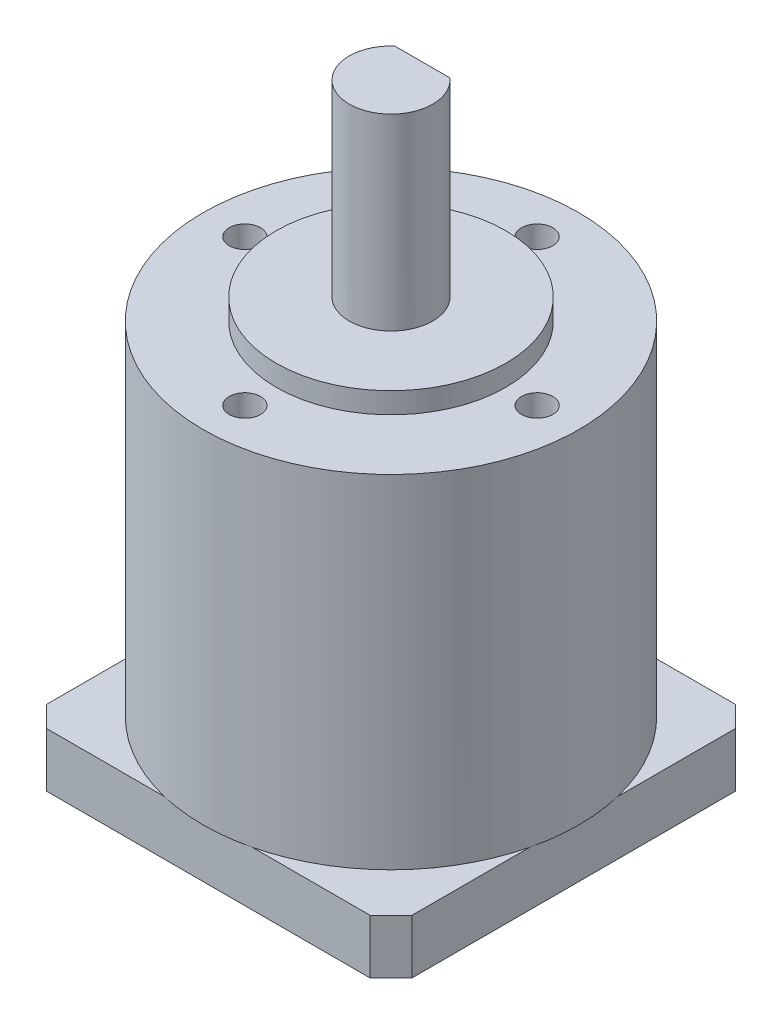
ISO-10303-21;
HEADER;
FILE_DESCRIPTION(('STEP AP214'),'2;1');
FILE_NAME('part.step','',(''),(''),'','','');
FILE_SCHEMA(('AUTOMOTIVE_DESIGN { 1 0 10303 214 1 1 1 1 }'));
ENDSEC;
DATA;
#1=APPLICATION_CONTEXT('core data for automotive mechanical design processes');
#2=APPLICATION_PROTOCOL_DEFINITION('international standard','automotive_design',2000,#1);
#3=PRODUCT_CONTEXT('',#1,'mechanical');
#4=PRODUCT('Part','Part','',(#3));
#5=PRODUCT_RELATED_PRODUCT_CATEGORY('part','',(#4));
#6=PRODUCT_DEFINITION_FORMATION('','',#4);
#7=PRODUCT_DEFINITION_CONTEXT('part definition',#1,'design');
#8=PRODUCT_DEFINITION('design','',#6,#7);
#9=PRODUCT_DEFINITION_SHAPE('','',#8);
#10=(LENGTH_UNIT() NAMED_UNIT(*) SI_UNIT(.MILLI.,.METRE.));
#11=(NAMED_UNIT(*) PLANE_ANGLE_UNIT() SI_UNIT($,.RADIAN.));
#12=(NAMED_UNIT(*) SI_UNIT($,.STERADIAN.) SOLID_ANGLE_UNIT());
#13=UNCERTAINTY_MEASURE_WITH_UNIT(LENGTH_MEASURE(1.E-05),#10,'distance_accuracy_value','');
#14=(GEOMETRIC_REPRESENTATION_CONTEXT(3) GLOBAL_UNCERTAINTY_ASSIGNED_CONTEXT((#13)) GLOBAL_UNIT_ASSIGNED_CONTEXT((#10,
#11,#12)) REPRESENTATION_CONTEXT('',''));
#15=CARTESIAN_POINT('',(0.,0.,0.));
#16=DIRECTION('',(0.,0.,1.));
#17=DIRECTION('',(1.,0.,0.));
#18=AXIS2_PLACEMENT_3D('',#15,#16,#17);
#19=CARTESIAN_POINT('',(0.,5.2,0.));
#20=DIRECTION('',(0.,1.,0.));
#21=DIRECTION('',(0.,0.,1.));
#22=AXIS2_PLACEMENT_3D('',#19,#20,#21);
#23=PLANE('',#22);
#24=DIRECTION('',(1.,0.,0.));
#25=VECTOR('',#24,1.);
#26=CARTESIAN_POINT('',(-17.5,5.2,17.5));
#27=LINE('',#26,#25);
#28=CARTESIAN_POINT('',(4.21307488658817,5.2,17.5));
#29=VERTEX_POINT('',#28);
#30=CARTESIAN_POINT('',(15.5,5.2,17.5));
#31=VERTEX_POINT('',#30);
#32=EDGE_CURVE('E211',#29,#31,#27,.T.);
#33=ORIENTED_EDGE('',*,*,#32,.T.);
#34=DIRECTION('',(-0.707106781186548,0.,0.707106781186547));
#35=VECTOR('',#34,1.);
#36=CARTESIAN_POINT('',(16.5,5.2,16.5));
#37=LINE('',#36,#35);
#38=CARTESIAN_POINT('',(17.5,5.2,15.5));
#39=VERTEX_POINT('',#38);
#40=EDGE_CURVE('E268',#31,#39,#37,.F.);
#41=ORIENTED_EDGE('',*,*,#40,.T.);
#42=DIRECTION('',(0.,0.,-1.));
#43=VECTOR('',#42,1.);
#44=CARTESIAN_POINT('',(17.5,5.2,-17.5));
#45=LINE('',#44,#43);
#46=CARTESIAN_POINT('',(17.5,5.2,4.21307488658818));
#47=VERTEX_POINT('',#46);
#48=EDGE_CURVE('E197',#39,#47,#45,.T.);
#49=ORIENTED_EDGE('',*,*,#48,.T.);
#50=CARTESIAN_POINT('',(0.,5.2,0.));
#51=DIRECTION('',(0.,1.,0.));
#52=DIRECTION('',(0.,0.,1.));
#53=AXIS2_PLACEMENT_3D('',#50,#51,#52);
#54=CIRCLE('',#53,18.);
#55=EDGE_CURVE('E192',#29,#47,#54,.T.);
#56=ORIENTED_EDGE('',*,*,#55,.F.);
#57=EDGE_LOOP('',(#33,#41,#49,#56));
#58=FACE_BOUND('',#57,.T.);
#59=ADVANCED_FACE('F40',(#58),#23,.T.);
#60=CARTESIAN_POINT('',(17.5,5.2,-4.21307488658819));
#61=VERTEX_POINT('',#60);
#62=CARTESIAN_POINT('',(17.5,5.2,-15.5));
#63=VERTEX_POINT('',#62);
#64=EDGE_CURVE('E202',#61,#63,#45,.T.);
#65=ORIENTED_EDGE('',*,*,#64,.T.);
#66=DIRECTION('',(0.707106781186546,0.,0.707106781186549));
#67=VECTOR('',#66,1.);
#68=CARTESIAN_POINT('',(16.5,5.2,-16.5));
#69=LINE('',#68,#67);
#70=CARTESIAN_POINT('',(15.5,5.2,-17.5));
#71=VERTEX_POINT('',#70);
#72=EDGE_CURVE('E258',#63,#71,#69,.F.);
#73=ORIENTED_EDGE('',*,*,#72,.T.);
#74=DIRECTION('',(-1.,0.,0.));
#75=VECTOR('',#74,1.);
#76=CARTESIAN_POINT('',(-17.5,5.2,-17.5));
#77=LINE('',#76,#75);
#78=CARTESIAN_POINT('',(4.21307488658817,5.2,-17.5));
#79=VERTEX_POINT('',#78);
#80=EDGE_CURVE('E203',#71,#79,#77,.T.);
#81=ORIENTED_EDGE('',*,*,#80,.T.);
#82=EDGE_CURVE('E186',#61,#79,#54,.T.);
#83=ORIENTED_EDGE('',*,*,#82,.F.);
#84=EDGE_LOOP('',(#65,#73,#81,#83));
#85=FACE_BOUND('',#84,.T.);
#86=ADVANCED_FACE('F420',(#85),#23,.T.);
#87=CARTESIAN_POINT('',(-4.21307488658817,5.2,-17.5));
#88=VERTEX_POINT('',#87);
#89=CARTESIAN_POINT('',(-15.5,5.2,-17.5));
#90=VERTEX_POINT('',#89);
#91=EDGE_CURVE('E200',#88,#90,#77,.T.);
#92=ORIENTED_EDGE('',*,*,#91,.T.);
#93=DIRECTION('',(0.707106781186548,0.,-0.707106781186548));
#94=VECTOR('',#93,1.);
#95=CARTESIAN_POINT('',(-16.5,5.2,-16.5));
#96=LINE('',#95,#94);
#97=CARTESIAN_POINT('',(-17.5,5.2,-15.5));
#98=VERTEX_POINT('',#97);
#99=EDGE_CURVE('E11',#90,#98,#96,.F.);
#100=ORIENTED_EDGE('',*,*,#99,.T.);
#101=DIRECTION('',(0.,0.,1.));
#102=VECTOR('',#101,1.);
#103=CARTESIAN_POINT('',(-17.5,5.2,-17.5));
#104=LINE('',#103,#102);
#105=CARTESIAN_POINT('',(-17.5,5.2,-4.21307488658815));
#106=VERTEX_POINT('',#105);
#107=EDGE_CURVE('E208',#98,#106,#104,.T.);
#108=ORIENTED_EDGE('',*,*,#107,.T.);
#109=EDGE_CURVE('E351',#88,#106,#54,.T.);
#110=ORIENTED_EDGE('',*,*,#109,.F.);
#111=EDGE_LOOP('',(#92,#100,#108,#110));
#112=FACE_BOUND('',#111,.T.);
#113=ADVANCED_FACE('F424',(#112),#23,.T.);
#114=CARTESIAN_POINT('',(17.5,5.2,-17.5));
#115=DIRECTION('',(-1.,0.,0.));
#116=DIRECTION('',(0.,0.,1.));
#117=AXIS2_PLACEMENT_3D('',#114,#115,#116);
#118=PLANE('',#117);
#119=DIRECTION('',(0.,0.,-1.));
#120=VECTOR('',#119,1.);
#121=CARTESIAN_POINT('',(17.5,0.,-17.5));
#122=LINE('',#121,#120);
#123=CARTESIAN_POINT('',(17.5,0.,15.5));
#124=VERTEX_POINT('',#123);
#125=CARTESIAN_POINT('',(17.5,0.,-15.5));
#126=VERTEX_POINT('',#125);
#127=EDGE_CURVE('E191',#124,#126,#122,.T.);
#128=ORIENTED_EDGE('',*,*,#127,.T.);
#129=DIRECTION('',(0.,1.,0.));
#130=VECTOR('',#129,1.);
#131=CARTESIAN_POINT('',(17.5,5.2,-15.5));
#132=LINE('',#131,#130);
#133=EDGE_CURVE('E255',#126,#63,#132,.T.);
#134=ORIENTED_EDGE('',*,*,#133,.T.);
#135=ORIENTED_EDGE('',*,*,#64,.F.);
#136=EDGE_CURVE('E201',#47,#61,#45,.T.);
#137=ORIENTED_EDGE('',*,*,#136,.F.);
#138=ORIENTED_EDGE('',*,*,#48,.F.);
#139=DIRECTION('',(0.,-1.,0.));
#140=VECTOR('',#139,1.);
#141=CARTESIAN_POINT('',(17.5,5.2,15.5));
#142=LINE('',#141,#140);
#143=EDGE_CURVE('E251',#39,#124,#142,.T.);
#144=ORIENTED_EDGE('',*,*,#143,.T.);
#145=EDGE_LOOP('',(#128,#134,#135,#137,#138,#144));
#146=FACE_BOUND('',#145,.T.);
#147=ADVANCED_FACE('F312',(#146),#118,.F.);
#148=CARTESIAN_POINT('',(-17.5,5.2,-17.5));
#149=DIRECTION('',(0.,0.,1.));
#150=DIRECTION('',(1.,0.,0.));
#151=AXIS2_PLACEMENT_3D('',#148,#149,#150);
#152=PLANE('',#151);
#153=ORIENTED_EDGE('',*,*,#80,.F.);
#154=DIRECTION('',(0.,-1.,0.));
#155=VECTOR('',#154,1.);
#156=CARTESIAN_POINT('',(15.5,5.2,-17.5));
#157=LINE('',#156,#155);
#158=CARTESIAN_POINT('',(15.5,0.,-17.5));
#159=VERTEX_POINT('',#158);
#160=EDGE_CURVE('E236',#71,#159,#157,.T.);
#161=ORIENTED_EDGE('',*,*,#160,.T.);
#162=DIRECTION('',(-1.,0.,0.));
#163=VECTOR('',#162,1.);
#164=CARTESIAN_POINT('',(-17.5,0.,-17.5));
#165=LINE('',#164,#163);
#166=CARTESIAN_POINT('',(-15.5,0.,-17.5));
#167=VERTEX_POINT('',#166);
#168=EDGE_CURVE('E220',#159,#167,#165,.T.);
#169=ORIENTED_EDGE('',*,*,#168,.T.);
#170=DIRECTION('',(0.,1.,0.));
#171=VECTOR('',#170,1.);
#172=CARTESIAN_POINT('',(-15.5,5.2,-17.5));
#173=LINE('',#172,#171);
#174=EDGE_CURVE('E233',#167,#90,#173,.T.);
#175=ORIENTED_EDGE('',*,*,#174,.T.);
#176=ORIENTED_EDGE('',*,*,#91,.F.);
#177=EDGE_CURVE('E207',#79,#88,#77,.T.);
#178=ORIENTED_EDGE('',*,*,#177,.F.);
#179=EDGE_LOOP('',(#153,#161,#169,#175,#176,#178));
#180=FACE_BOUND('',#179,.T.);
#181=ADVANCED_FACE('F302',(#180),#152,.F.);
#182=CARTESIAN_POINT('',(-17.5,5.2,-17.5));
#183=DIRECTION('',(1.,0.,0.));
#184=DIRECTION('',(0.,0.,-1.));
#185=AXIS2_PLACEMENT_3D('',#182,#183,#184);
#186=PLANE('',#185);
#187=DIRECTION('',(0.,0.,1.));
#188=VECTOR('',#187,1.);
#189=CARTESIAN_POINT('',(-17.5,0.,-17.5));
#190=LINE('',#189,#188);
#191=CARTESIAN_POINT('',(-17.5,0.,-15.5));
#192=VERTEX_POINT('',#191);
#193=CARTESIAN_POINT('',(-17.5,0.,15.5));
#194=VERTEX_POINT('',#193);
#195=EDGE_CURVE('E224',#192,#194,#190,.T.);
#196=ORIENTED_EDGE('',*,*,#195,.T.);
#197=DIRECTION('',(0.,1.,0.));
#198=VECTOR('',#197,1.);
#199=CARTESIAN_POINT('',(-17.5,5.2,15.5));
#200=LINE('',#199,#198);
#201=CARTESIAN_POINT('',(-17.5,5.2,15.5));
#202=VERTEX_POINT('',#201);
#203=EDGE_CURVE('E63',#194,#202,#200,.T.);
#204=ORIENTED_EDGE('',*,*,#203,.T.);
#205=CARTESIAN_POINT('',(-17.5,5.2,4.21307488658816));
#206=VERTEX_POINT('',#205);
#207=EDGE_CURVE('E206',#206,#202,#104,.T.);
#208=ORIENTED_EDGE('',*,*,#207,.F.);
#209=EDGE_CURVE('E212',#106,#206,#104,.T.);
#210=ORIENTED_EDGE('',*,*,#209,.F.);
#211=ORIENTED_EDGE('',*,*,#107,.F.);
#212=DIRECTION('',(0.,-1.,0.));
#213=VECTOR('',#212,1.);
#214=CARTESIAN_POINT('',(-17.5,5.2,-15.5));
#215=LINE('',#214,#213);
#216=EDGE_CURVE('E271',#98,#192,#215,.T.);
#217=ORIENTED_EDGE('',*,*,#216,.T.);
#218=EDGE_LOOP('',(#196,#204,#208,#210,#211,#217));
#219=FACE_BOUND('',#218,.T.);
#220=ADVANCED_FACE('F295',(#219),#186,.F.);
#221=CARTESIAN_POINT('',(-17.5,5.2,17.5));
#222=DIRECTION('',(0.,0.,-1.));
#223=DIRECTION('',(-1.,0.,0.));
#224=AXIS2_PLACEMENT_3D('',#221,#222,#223);
#225=PLANE('',#224);
#226=DIRECTION('',(1.,0.,0.));
#227=VECTOR('',#226,1.);
#228=CARTESIAN_POINT('',(-17.5,0.,17.5));
#229=LINE('',#228,#227);
#230=CARTESIAN_POINT('',(-15.5,0.,17.5));
#231=VERTEX_POINT('',#230);
#232=CARTESIAN_POINT('',(15.5,0.,17.5));
#233=VERTEX_POINT('',#232);
#234=EDGE_CURVE('E227',#231,#233,#229,.T.);
#235=ORIENTED_EDGE('',*,*,#234,.T.);
#236=DIRECTION('',(0.,1.,0.));
#237=VECTOR('',#236,1.);
#238=CARTESIAN_POINT('',(15.5,5.2,17.5));
#239=LINE('',#238,#237);
#240=EDGE_CURVE('E265',#233,#31,#239,.T.);
#241=ORIENTED_EDGE('',*,*,#240,.T.);
#242=ORIENTED_EDGE('',*,*,#32,.F.);
#243=CARTESIAN_POINT('',(-4.21307488658817,5.2,17.5));
#244=VERTEX_POINT('',#243);
#245=EDGE_CURVE('E216',#244,#29,#27,.T.);
#246=ORIENTED_EDGE('',*,*,#245,.F.);
#247=CARTESIAN_POINT('',(-15.5,5.2,17.5));
#248=VERTEX_POINT('',#247);
#249=EDGE_CURVE('E213',#248,#244,#27,.T.);
#250=ORIENTED_EDGE('',*,*,#249,.F.);
#251=DIRECTION('',(0.,-1.,0.));
#252=VECTOR('',#251,1.);
#253=CARTESIAN_POINT('',(-15.5,5.2,17.5));
#254=LINE('',#253,#252);
#255=EDGE_CURVE('E261',#248,#231,#254,.T.);
#256=ORIENTED_EDGE('',*,*,#255,.T.);
#257=EDGE_LOOP('',(#235,#241,#242,#246,#250,#256));
#258=FACE_BOUND('',#257,.T.);
#259=ADVANCED_FACE('F285',(#258),#225,.F.);
#260=ORIENTED_EDGE('',*,*,#207,.T.);
#261=DIRECTION('',(-0.707106781186548,0.,-0.707106781186548));
#262=VECTOR('',#261,1.);
#263=CARTESIAN_POINT('',(-16.5,5.2,16.5));
#264=LINE('',#263,#262);
#265=EDGE_CURVE('E50',#202,#248,#264,.F.);
#266=ORIENTED_EDGE('',*,*,#265,.T.);
#267=ORIENTED_EDGE('',*,*,#249,.T.);
#268=EDGE_CURVE('E196',#206,#244,#54,.T.);
#269=ORIENTED_EDGE('',*,*,#268,.F.);
#270=EDGE_LOOP('',(#260,#266,#267,#269));
#271=FACE_BOUND('',#270,.T.);
#272=ADVANCED_FACE('F280',(#271),#23,.T.);
#273=CARTESIAN_POINT('',(0.,0.,0.));
#274=DIRECTION('',(0.,1.,0.));
#275=DIRECTION('',(0.,0.,1.));
#276=AXIS2_PLACEMENT_3D('',#273,#274,#275);
#277=PLANE('',#276);
#278=ORIENTED_EDGE('',*,*,#168,.F.);
#279=DIRECTION('',(-0.707106781186546,0.,-0.707106781186549));
#280=VECTOR('',#279,1.);
#281=CARTESIAN_POINT('',(15.5,0.,-17.5));
#282=LINE('',#281,#280);
#283=EDGE_CURVE('E249',#159,#126,#282,.F.);
#284=ORIENTED_EDGE('',*,*,#283,.T.);
#285=ORIENTED_EDGE('',*,*,#127,.F.);
#286=DIRECTION('',(0.707106781186548,0.,-0.707106781186547));
#287=VECTOR('',#286,1.);
#288=CARTESIAN_POINT('',(17.5,0.,15.5));
#289=LINE('',#288,#287);
#290=EDGE_CURVE('E246',#124,#233,#289,.F.);
#291=ORIENTED_EDGE('',*,*,#290,.T.);
#292=ORIENTED_EDGE('',*,*,#234,.F.);
#293=DIRECTION('',(0.707106781186548,0.,0.707106781186548));
#294=VECTOR('',#293,1.);
#295=CARTESIAN_POINT('',(-15.5,0.,17.5));
#296=LINE('',#295,#294);
#297=EDGE_CURVE('E243',#231,#194,#296,.F.);
#298=ORIENTED_EDGE('',*,*,#297,.T.);
#299=ORIENTED_EDGE('',*,*,#195,.F.);
#300=DIRECTION('',(-0.707106781186548,0.,0.707106781186548));
#301=VECTOR('',#300,1.);
#302=CARTESIAN_POINT('',(-17.5,0.,-15.5));
#303=LINE('',#302,#301);
#304=EDGE_CURVE('E240',#192,#167,#303,.F.);
#305=ORIENTED_EDGE('',*,*,#304,.T.);
#306=EDGE_LOOP('',(#278,#284,#285,#291,#292,#298,#299,#305));
#307=FACE_BOUND('',#306,.T.);
#308=ADVANCED_FACE('F294',(#307),#277,.F.);
#309=CARTESIAN_POINT('',(0.,5.2,0.));
#310=DIRECTION('',(0.,1.,0.));
#311=DIRECTION('',(0.,0.,1.));
#312=AXIS2_PLACEMENT_3D('',#309,#310,#311);
#313=PLANE('',#312);
#314=EDGE_CURVE('E195',#47,#61,#54,.T.);
#315=ORIENTED_EDGE('',*,*,#314,.F.);
#316=ORIENTED_EDGE('',*,*,#136,.T.);
#317=EDGE_LOOP('',(#315,#316));
#318=FACE_BOUND('',#317,.T.);
#319=ADVANCED_FACE('F417',(#318),#313,.F.);
#320=EDGE_CURVE('E339',#79,#88,#54,.T.);
#321=ORIENTED_EDGE('',*,*,#320,.F.);
#322=ORIENTED_EDGE('',*,*,#177,.T.);
#323=EDGE_LOOP('',(#321,#322));
#324=FACE_BOUND('',#323,.T.);
#325=ADVANCED_FACE('F441',(#324),#313,.F.);
#326=EDGE_CURVE('E336',#106,#206,#54,.T.);
#327=ORIENTED_EDGE('',*,*,#326,.F.);
#328=ORIENTED_EDGE('',*,*,#209,.T.);
#329=EDGE_LOOP('',(#327,#328));
#330=FACE_BOUND('',#329,.T.);
#331=ADVANCED_FACE('F415',(#330),#313,.F.);
#332=EDGE_CURVE('E174',#244,#29,#54,.T.);
#333=ORIENTED_EDGE('',*,*,#332,.F.);
#334=ORIENTED_EDGE('',*,*,#245,.T.);
#335=EDGE_LOOP('',(#333,#334));
#336=FACE_BOUND('',#335,.T.);
#337=ADVANCED_FACE('F329',(#336),#313,.F.);
#338=CARTESIAN_POINT('',(0.,38.,0.));
#339=DIRECTION('',(0.,-1.,0.));
#340=DIRECTION('',(0.,0.,-1.));
#341=AXIS2_PLACEMENT_3D('',#338,#339,#340);
#342=CYLINDRICAL_SURFACE('',#341,18.);
#343=CARTESIAN_POINT('',(0.,38.,0.));
#344=DIRECTION('',(0.,1.,0.));
#345=DIRECTION('',(0.,0.,1.));
#346=AXIS2_PLACEMENT_3D('',#343,#344,#345);
#347=CIRCLE('',#346,18.);
#348=CARTESIAN_POINT('',(0.,38.,18.));
#349=VERTEX_POINT('',#348);
#350=EDGE_CURVE('E187',#349,#349,#347,.T.);
#351=ORIENTED_EDGE('',*,*,#350,.F.);
#352=EDGE_LOOP('',(#351));
#353=FACE_BOUND('',#352,.T.);
#354=ORIENTED_EDGE('',*,*,#55,.T.);
#355=ORIENTED_EDGE('',*,*,#314,.T.);
#356=ORIENTED_EDGE('',*,*,#82,.T.);
#357=ORIENTED_EDGE('',*,*,#320,.T.);
#358=ORIENTED_EDGE('',*,*,#109,.T.);
#359=ORIENTED_EDGE('',*,*,#326,.T.);
#360=ORIENTED_EDGE('',*,*,#268,.T.);
#361=ORIENTED_EDGE('',*,*,#332,.T.);
#362=EDGE_LOOP('',(#354,#355,#356,#357,#358,#359,#360,#361));
#363=FACE_BOUND('',#362,.T.);
#364=ADVANCED_FACE('F332',(#353,#363),#342,.T.);
#365=CARTESIAN_POINT('',(0.,38.,0.));
#366=DIRECTION('',(0.,1.,0.));
#367=DIRECTION('',(0.,0.,1.));
#368=AXIS2_PLACEMENT_3D('',#365,#366,#367);
#369=PLANE('',#368);
#370=CARTESIAN_POINT('',(0.,38.,-14.));
#371=DIRECTION('',(0.,1.,0.));
#372=DIRECTION('',(0.,0.,1.));
#373=AXIS2_PLACEMENT_3D('',#370,#371,#372);
#374=CIRCLE('',#373,1.5);
#375=CARTESIAN_POINT('',(0.,38.,-12.5));
#376=VERTEX_POINT('',#375);
#377=EDGE_CURVE('E366',#376,#376,#374,.T.);
#378=ORIENTED_EDGE('',*,*,#377,.F.);
#379=EDGE_LOOP('',(#378));
#380=FACE_BOUND('',#379,.T.);
#381=CARTESIAN_POINT('',(14.,38.,0.));
#382=DIRECTION('',(0.,1.,0.));
#383=DIRECTION('',(0.,0.,1.));
#384=AXIS2_PLACEMENT_3D('',#381,#382,#383);
#385=CIRCLE('',#384,1.5);
#386=CARTESIAN_POINT('',(14.,38.,1.50000000000005));
#387=VERTEX_POINT('',#386);
#388=EDGE_CURVE('E357',#387,#387,#385,.T.);
#389=ORIENTED_EDGE('',*,*,#388,.F.);
#390=EDGE_LOOP('',(#389));
#391=FACE_BOUND('',#390,.T.);
#392=CARTESIAN_POINT('',(0.,38.,14.));
#393=DIRECTION('',(0.,1.,0.));
#394=DIRECTION('',(0.,0.,1.));
#395=AXIS2_PLACEMENT_3D('',#392,#393,#394);
#396=CIRCLE('',#395,1.50000000000009);
#397=CARTESIAN_POINT('',(0.,38.,15.5000000000001));
#398=VERTEX_POINT('',#397);
#399=EDGE_CURVE('E370',#398,#398,#396,.T.);
#400=ORIENTED_EDGE('',*,*,#399,.F.);
#401=EDGE_LOOP('',(#400));
#402=FACE_BOUND('',#401,.T.);
#403=CARTESIAN_POINT('',(-14.,38.,0.));
#404=DIRECTION('',(0.,1.,0.));
#405=DIRECTION('',(0.,0.,1.));
#406=AXIS2_PLACEMENT_3D('',#403,#404,#405);
#407=CIRCLE('',#406,1.50000000000014);
#408=CARTESIAN_POINT('',(-14.,38.,1.50000000000015));
#409=VERTEX_POINT('',#408);
#410=EDGE_CURVE('E379',#409,#409,#407,.T.);
#411=ORIENTED_EDGE('',*,*,#410,.F.);
#412=EDGE_LOOP('',(#411));
#413=FACE_BOUND('',#412,.T.);
#414=CARTESIAN_POINT('',(0.,38.,0.));
#415=DIRECTION('',(0.,1.,0.));
#416=DIRECTION('',(0.,0.,1.));
#417=AXIS2_PLACEMENT_3D('',#414,#415,#416);
#418=CIRCLE('',#417,11.);
#419=CARTESIAN_POINT('',(0.,38.,11.));
#420=VERTEX_POINT('',#419);
#421=EDGE_CURVE('E181',#420,#420,#418,.T.);
#422=ORIENTED_EDGE('',*,*,#421,.F.);
#423=EDGE_LOOP('',(#422));
#424=FACE_BOUND('',#423,.T.);
#425=ORIENTED_EDGE('',*,*,#350,.T.);
#426=EDGE_LOOP('',(#425));
#427=FACE_BOUND('',#426,.T.);
#428=ADVANCED_FACE('F396',(#380,#391,#402,#413,#424,#427),#369,.T.);
#429=CARTESIAN_POINT('',(0.,40.,0.));
#430=DIRECTION('',(0.,-1.,0.));
#431=DIRECTION('',(0.,0.,-1.));
#432=AXIS2_PLACEMENT_3D('',#429,#430,#431);
#433=CYLINDRICAL_SURFACE('',#432,11.);
#434=CARTESIAN_POINT('',(0.,40.,0.));
#435=DIRECTION('',(0.,1.,0.));
#436=DIRECTION('',(0.,0.,1.));
#437=AXIS2_PLACEMENT_3D('',#434,#435,#436);
#438=CIRCLE('',#437,11.);
#439=CARTESIAN_POINT('',(0.,40.,11.));
#440=VERTEX_POINT('',#439);
#441=EDGE_CURVE('E168',#440,#440,#438,.T.);
#442=ORIENTED_EDGE('',*,*,#441,.F.);
#443=EDGE_LOOP('',(#442));
#444=FACE_BOUND('',#443,.T.);
#445=ORIENTED_EDGE('',*,*,#421,.T.);
#446=EDGE_LOOP('',(#445));
#447=FACE_BOUND('',#446,.T.);
#448=ADVANCED_FACE('F399',(#444,#447),#433,.T.);
#449=CARTESIAN_POINT('',(0.,40.,0.));
#450=DIRECTION('',(0.,1.,0.));
#451=DIRECTION('',(0.,0.,1.));
#452=AXIS2_PLACEMENT_3D('',#449,#450,#451);
#453=PLANE('',#452);
#454=CARTESIAN_POINT('',(0.,40.,0.));
#455=DIRECTION('',(0.,1.,0.));
#456=DIRECTION('',(0.,0.,1.));
#457=AXIS2_PLACEMENT_3D('',#454,#455,#456);
#458=CIRCLE('',#457,4.);
#459=CARTESIAN_POINT('',(0.,40.,4.));
#460=VERTEX_POINT('',#459);
#461=EDGE_CURVE('E156',#460,#460,#458,.T.);
#462=ORIENTED_EDGE('',*,*,#461,.F.);
#463=EDGE_LOOP('',(#462));
#464=FACE_BOUND('',#463,.T.);
#465=ORIENTED_EDGE('',*,*,#441,.T.);
#466=EDGE_LOOP('',(#465));
#467=FACE_BOUND('',#466,.T.);
#468=ADVANCED_FACE('F452',(#464,#467),#453,.T.);
#469=CARTESIAN_POINT('',(0.,58.,0.));
#470=DIRECTION('',(0.,-1.,0.));
#471=DIRECTION('',(0.,0.,-1.));
#472=AXIS2_PLACEMENT_3D('',#469,#470,#471);
#473=CYLINDRICAL_SURFACE('',#472,4.);
#474=CARTESIAN_POINT('',(0.,58.,0.));
#475=DIRECTION('',(0.,1.,0.));
#476=DIRECTION('',(0.,0.,1.));
#477=AXIS2_PLACEMENT_3D('',#474,#475,#476);
#478=CIRCLE('',#477,4.);
#479=CARTESIAN_POINT('',(-2.64575131106459,58.,-3.));
#480=VERTEX_POINT('',#479);
#481=CARTESIAN_POINT('',(2.64575131106459,58.,-3.));
#482=VERTEX_POINT('',#481);
#483=EDGE_CURVE('E162',#480,#482,#478,.T.);
#484=ORIENTED_EDGE('',*,*,#483,.F.);
#485=DIRECTION('',(0.,-1.,0.));
#486=VECTOR('',#485,1.);
#487=CARTESIAN_POINT('',(-2.64575131106459,58.,-3.));
#488=LINE('',#487,#486);
#489=CARTESIAN_POINT('',(-2.64575131106459,43.,-3.));
#490=VERTEX_POINT('',#489);
#491=EDGE_CURVE('E150',#480,#490,#488,.T.);
#492=ORIENTED_EDGE('',*,*,#491,.T.);
#493=CARTESIAN_POINT('',(0.,43.,0.));
#494=DIRECTION('',(0.,-1.,0.));
#495=DIRECTION('',(0.,0.,-1.));
#496=AXIS2_PLACEMENT_3D('',#493,#494,#495);
#497=CIRCLE('',#496,4.);
#498=CARTESIAN_POINT('',(2.64575131106459,43.,-3.));
#499=VERTEX_POINT('',#498);
#500=EDGE_CURVE('E155',#490,#499,#497,.T.);
#501=ORIENTED_EDGE('',*,*,#500,.T.);
#502=DIRECTION('',(0.,-1.,0.));
#503=VECTOR('',#502,1.);
#504=CARTESIAN_POINT('',(2.64575131106459,58.,-3.));
#505=LINE('',#504,#503);
#506=EDGE_CURVE('E147',#499,#482,#505,.F.);
#507=ORIENTED_EDGE('',*,*,#506,.T.);
#508=EDGE_LOOP('',(#484,#492,#501,#507));
#509=FACE_BOUND('',#508,.T.);
#510=ORIENTED_EDGE('',*,*,#461,.T.);
#511=EDGE_LOOP('',(#510));
#512=FACE_BOUND('',#511,.T.);
#513=ADVANCED_FACE('F160',(#509,#512),#473,.T.);
#514=CARTESIAN_POINT('',(0.,58.,0.));
#515=DIRECTION('',(0.,1.,0.));
#516=DIRECTION('',(0.,0.,1.));
#517=AXIS2_PLACEMENT_3D('',#514,#515,#516);
#518=PLANE('',#517);
#519=DIRECTION('',(1.,0.,0.));
#520=VECTOR('',#519,1.);
#521=CARTESIAN_POINT('',(0.,58.,-3.));
#522=LINE('',#521,#520);
#523=EDGE_CURVE('E143',#480,#482,#522,.T.);
#524=ORIENTED_EDGE('',*,*,#523,.F.);
#525=ORIENTED_EDGE('',*,*,#483,.T.);
#526=EDGE_LOOP('',(#524,#525));
#527=FACE_BOUND('',#526,.T.);
#528=ADVANCED_FACE('F166',(#527),#518,.T.);
#529=CARTESIAN_POINT('',(0.,43.,0.));
#530=DIRECTION('',(0.,-1.,0.));
#531=DIRECTION('',(0.,0.,-1.));
#532=AXIS2_PLACEMENT_3D('',#529,#530,#531);
#533=PLANE('',#532);
#534=DIRECTION('',(1.,0.,0.));
#535=VECTOR('',#534,1.);
#536=CARTESIAN_POINT('',(5.27340823970037,43.,-3.));
#537=LINE('',#536,#535);
#538=EDGE_CURVE('E164',#490,#499,#537,.T.);
#539=ORIENTED_EDGE('',*,*,#538,.T.);
#540=ORIENTED_EDGE('',*,*,#500,.F.);
#541=EDGE_LOOP('',(#539,#540));
#542=FACE_BOUND('',#541,.T.);
#543=ADVANCED_FACE('F461',(#542),#533,.F.);
#544=CARTESIAN_POINT('',(5.27340823970037,43.,-3.));
#545=DIRECTION('',(0.,0.,1.));
#546=DIRECTION('',(1.,0.,0.));
#547=AXIS2_PLACEMENT_3D('',#544,#545,#546);
#548=PLANE('',#547);
#549=ORIENTED_EDGE('',*,*,#523,.T.);
#550=ORIENTED_EDGE('',*,*,#506,.F.);
#551=ORIENTED_EDGE('',*,*,#538,.F.);
#552=ORIENTED_EDGE('',*,*,#491,.F.);
#553=EDGE_LOOP('',(#549,#550,#551,#552));
#554=FACE_BOUND('',#553,.T.);
#555=ADVANCED_FACE('F145',(#554),#548,.F.);
#556=CARTESIAN_POINT('',(15.5,5.2,-17.5));
#557=DIRECTION('',(-0.707106781186549,0.,0.707106781186546));
#558=DIRECTION('',(0.,-1.,0.));
#559=AXIS2_PLACEMENT_3D('',#556,#557,#558);
#560=PLANE('',#559);
#561=ORIENTED_EDGE('',*,*,#72,.F.);
#562=ORIENTED_EDGE('',*,*,#133,.F.);
#563=ORIENTED_EDGE('',*,*,#283,.F.);
#564=ORIENTED_EDGE('',*,*,#160,.F.);
#565=EDGE_LOOP('',(#561,#562,#563,#564));
#566=FACE_BOUND('',#565,.T.);
#567=ADVANCED_FACE('F308',(#566),#560,.F.);
#568=CARTESIAN_POINT('',(17.5,5.2,15.5));
#569=DIRECTION('',(-0.707106781186547,0.,-0.707106781186548));
#570=DIRECTION('',(0.,-1.,0.));
#571=AXIS2_PLACEMENT_3D('',#568,#569,#570);
#572=PLANE('',#571);
#573=ORIENTED_EDGE('',*,*,#40,.F.);
#574=ORIENTED_EDGE('',*,*,#240,.F.);
#575=ORIENTED_EDGE('',*,*,#290,.F.);
#576=ORIENTED_EDGE('',*,*,#143,.F.);
#577=EDGE_LOOP('',(#573,#574,#575,#576));
#578=FACE_BOUND('',#577,.T.);
#579=ADVANCED_FACE('F320',(#578),#572,.F.);
#580=CARTESIAN_POINT('',(-15.5,5.2,17.5));
#581=DIRECTION('',(0.707106781186547,0.,-0.707106781186547));
#582=DIRECTION('',(0.,-1.,0.));
#583=AXIS2_PLACEMENT_3D('',#580,#581,#582);
#584=PLANE('',#583);
#585=ORIENTED_EDGE('',*,*,#265,.F.);
#586=ORIENTED_EDGE('',*,*,#203,.F.);
#587=ORIENTED_EDGE('',*,*,#297,.F.);
#588=ORIENTED_EDGE('',*,*,#255,.F.);
#589=EDGE_LOOP('',(#585,#586,#587,#588));
#590=FACE_BOUND('',#589,.T.);
#591=ADVANCED_FACE('F290',(#590),#584,.F.);
#592=CARTESIAN_POINT('',(-17.5,5.2,-15.5));
#593=DIRECTION('',(0.707106781186547,0.,0.707106781186547));
#594=DIRECTION('',(0.,-1.,0.));
#595=AXIS2_PLACEMENT_3D('',#592,#593,#594);
#596=PLANE('',#595);
#597=ORIENTED_EDGE('',*,*,#99,.F.);
#598=ORIENTED_EDGE('',*,*,#174,.F.);
#599=ORIENTED_EDGE('',*,*,#304,.F.);
#600=ORIENTED_EDGE('',*,*,#216,.F.);
#601=EDGE_LOOP('',(#597,#598,#599,#600));
#602=FACE_BOUND('',#601,.T.);
#603=ADVANCED_FACE('F43',(#602),#596,.F.);
#604=CARTESIAN_POINT('',(-14.,32.,0.));
#605=DIRECTION('',(0.,1.,0.));
#606=DIRECTION('',(0.,0.,1.));
#607=AXIS2_PLACEMENT_3D('',#604,#605,#606);
#608=CYLINDRICAL_SURFACE('',#607,1.50000000000014);
#609=CARTESIAN_POINT('',(-14.,32.,0.));
#610=DIRECTION('',(0.,1.,0.));
#611=DIRECTION('',(0.,0.,1.));
#612=AXIS2_PLACEMENT_3D('',#609,#610,#611);
#613=CIRCLE('',#612,1.50000000000014);
#614=CARTESIAN_POINT('',(-14.,32.,1.50000000000015));
#615=VERTEX_POINT('',#614);
#616=EDGE_CURVE('E376',#615,#615,#613,.T.);
#617=ORIENTED_EDGE('',*,*,#616,.F.);
#618=EDGE_LOOP('',(#617));
#619=FACE_BOUND('',#618,.T.);
#620=ORIENTED_EDGE('',*,*,#410,.T.);
#621=EDGE_LOOP('',(#620));
#622=FACE_BOUND('',#621,.T.);
#623=ADVANCED_FACE('F466',(#619,#622),#608,.F.);
#624=CARTESIAN_POINT('',(-14.,32.,0.));
#625=DIRECTION('',(0.,1.,0.));
#626=DIRECTION('',(0.,0.,1.));
#627=AXIS2_PLACEMENT_3D('',#624,#625,#626);
#628=PLANE('',#627);
#629=ORIENTED_EDGE('',*,*,#616,.T.);
#630=EDGE_LOOP('',(#629));
#631=FACE_BOUND('',#630,.T.);
#632=ADVANCED_FACE('F469',(#631),#628,.T.);
#633=CARTESIAN_POINT('',(0.,32.,14.));
#634=DIRECTION('',(0.,1.,0.));
#635=DIRECTION('',(0.,0.,1.));
#636=AXIS2_PLACEMENT_3D('',#633,#634,#635);
#637=CYLINDRICAL_SURFACE('',#636,1.50000000000009);
#638=CARTESIAN_POINT('',(0.,32.,14.));
#639=DIRECTION('',(0.,1.,0.));
#640=DIRECTION('',(0.,0.,1.));
#641=AXIS2_PLACEMENT_3D('',#638,#639,#640);
#642=CIRCLE('',#641,1.50000000000009);
#643=CARTESIAN_POINT('',(0.,32.,15.5000000000001));
#644=VERTEX_POINT('',#643);
#645=EDGE_CURVE('E360',#644,#644,#642,.T.);
#646=ORIENTED_EDGE('',*,*,#645,.F.);
#647=EDGE_LOOP('',(#646));
#648=FACE_BOUND('',#647,.T.);
#649=ORIENTED_EDGE('',*,*,#399,.T.);
#650=EDGE_LOOP('',(#649));
#651=FACE_BOUND('',#650,.T.);
#652=ADVANCED_FACE('F473',(#648,#651),#637,.F.);
#653=CARTESIAN_POINT('',(0.,32.,14.));
#654=DIRECTION('',(0.,1.,0.));
#655=DIRECTION('',(0.,0.,1.));
#656=AXIS2_PLACEMENT_3D('',#653,#654,#655);
#657=PLANE('',#656);
#658=ORIENTED_EDGE('',*,*,#645,.T.);
#659=EDGE_LOOP('',(#658));
#660=FACE_BOUND('',#659,.T.);
#661=ADVANCED_FACE('F477',(#660),#657,.T.);
#662=CARTESIAN_POINT('',(14.,32.,0.));
#663=DIRECTION('',(0.,1.,0.));
#664=DIRECTION('',(0.,0.,1.));
#665=AXIS2_PLACEMENT_3D('',#662,#663,#664);
#666=CYLINDRICAL_SURFACE('',#665,1.5);
#667=CARTESIAN_POINT('',(14.,32.,0.));
#668=DIRECTION('',(0.,1.,0.));
#669=DIRECTION('',(0.,0.,1.));
#670=AXIS2_PLACEMENT_3D('',#667,#668,#669);
#671=CIRCLE('',#670,1.5);
#672=CARTESIAN_POINT('',(14.,32.,1.50000000000005));
#673=VERTEX_POINT('',#672);
#674=EDGE_CURVE('E359',#673,#673,#671,.T.);
#675=ORIENTED_EDGE('',*,*,#674,.F.);
#676=EDGE_LOOP('',(#675));
#677=FACE_BOUND('',#676,.T.);
#678=ORIENTED_EDGE('',*,*,#388,.T.);
#679=EDGE_LOOP('',(#678));
#680=FACE_BOUND('',#679,.T.);
#681=ADVANCED_FACE('F481',(#677,#680),#666,.F.);
#682=CARTESIAN_POINT('',(14.,32.,0.));
#683=DIRECTION('',(0.,1.,0.));
#684=DIRECTION('',(0.,0.,1.));
#685=AXIS2_PLACEMENT_3D('',#682,#683,#684);
#686=PLANE('',#685);
#687=ORIENTED_EDGE('',*,*,#674,.T.);
#688=EDGE_LOOP('',(#687));
#689=FACE_BOUND('',#688,.T.);
#690=ADVANCED_FACE('F485',(#689),#686,.T.);
#691=CARTESIAN_POINT('',(0.,32.,-14.));
#692=DIRECTION('',(0.,1.,0.));
#693=DIRECTION('',(0.,0.,1.));
#694=AXIS2_PLACEMENT_3D('',#691,#692,#693);
#695=CYLINDRICAL_SURFACE('',#694,1.5);
#696=CARTESIAN_POINT('',(0.,32.,-14.));
#697=DIRECTION('',(0.,1.,0.));
#698=DIRECTION('',(0.,0.,1.));
#699=AXIS2_PLACEMENT_3D('',#696,#697,#698);
#700=CIRCLE('',#699,1.5);
#701=CARTESIAN_POINT('',(0.,32.,-12.5));
#702=VERTEX_POINT('',#701);
#703=EDGE_CURVE('E383',#702,#702,#700,.T.);
#704=ORIENTED_EDGE('',*,*,#703,.F.);
#705=EDGE_LOOP('',(#704));
#706=FACE_BOUND('',#705,.T.);
#707=ORIENTED_EDGE('',*,*,#377,.T.);
#708=EDGE_LOOP('',(#707));
#709=FACE_BOUND('',#708,.T.);
#710=ADVANCED_FACE('F394',(#706,#709),#695,.F.);
#711=CARTESIAN_POINT('',(0.,32.,-14.));
#712=DIRECTION('',(0.,1.,0.));
#713=DIRECTION('',(0.,0.,1.));
#714=AXIS2_PLACEMENT_3D('',#711,#712,#713);
#715=PLANE('',#714);
#716=ORIENTED_EDGE('',*,*,#703,.T.);
#717=EDGE_LOOP('',(#716));
#718=FACE_BOUND('',#717,.T.);
#719=ADVANCED_FACE('F492',(#718),#715,.T.);
#720=CLOSED_SHELL('',(#59,#86,#113,#147,#181,#220,#259,#272,#308,#319,#325,#331,#337,#364,#428,
#448,#468,#513,#528,#543,#555,#567,#579,#591,#603,#623,#632,#652,#661,#681,#690,#710,#719));
#721=MANIFOLD_SOLID_BREP('B2',#720);
#722=ADVANCED_BREP_SHAPE_REPRESENTATION('',(#18,#721),#14);
#723=SHAPE_DEFINITION_REPRESENTATION(#9,#722);
ENDSEC;
END-ISO-10303-21;
